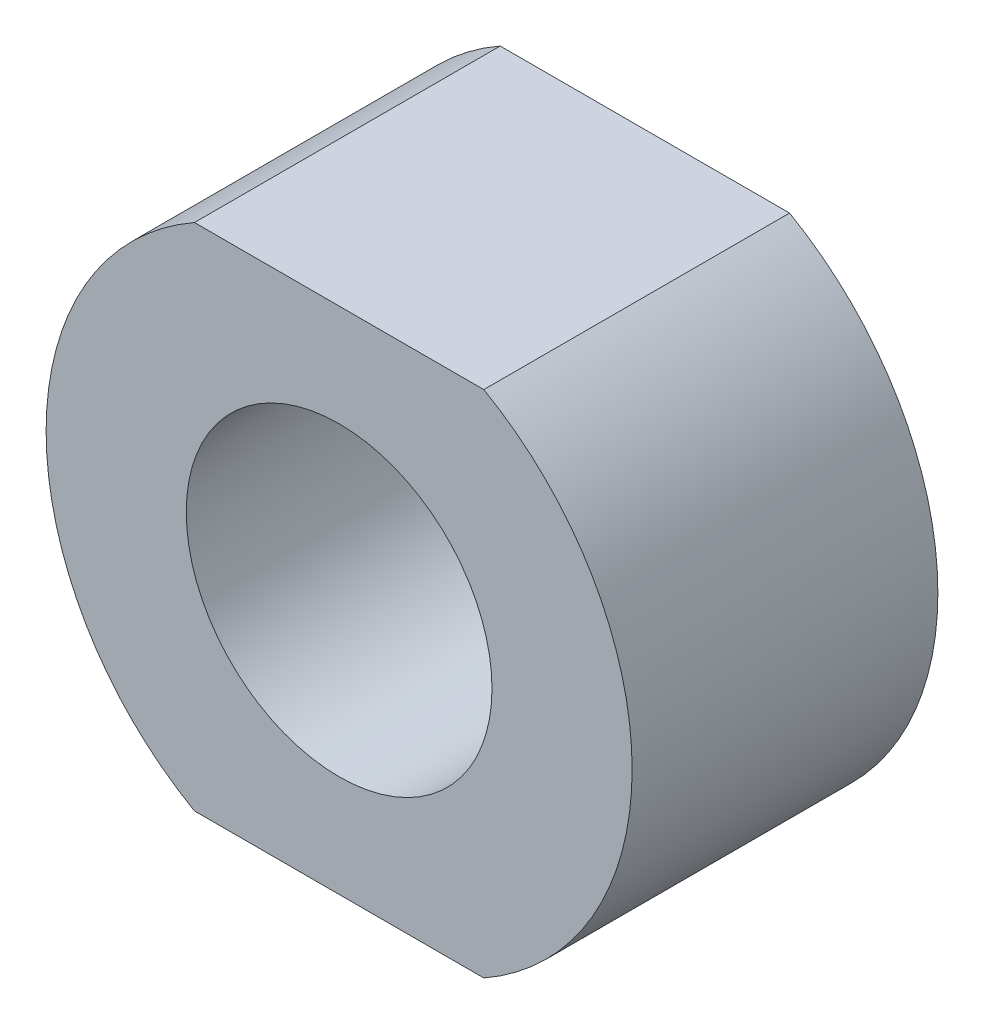
ISO-10303-21;
HEADER;
FILE_DESCRIPTION(('STEP AP214'),'2;1');
FILE_NAME('part.step','',(''),(''),'','','');
FILE_SCHEMA(('AUTOMOTIVE_DESIGN { 1 0 10303 214 1 1 1 1 }'));
ENDSEC;
DATA;
#1=APPLICATION_CONTEXT('core data for automotive mechanical design processes');
#2=APPLICATION_PROTOCOL_DEFINITION('international standard','automotive_design',2000,#1);
#3=PRODUCT_CONTEXT('',#1,'mechanical');
#4=PRODUCT('Part','Part','',(#3));
#5=PRODUCT_RELATED_PRODUCT_CATEGORY('part','',(#4));
#6=PRODUCT_DEFINITION_FORMATION('','',#4);
#7=PRODUCT_DEFINITION_CONTEXT('part definition',#1,'design');
#8=PRODUCT_DEFINITION('design','',#6,#7);
#9=PRODUCT_DEFINITION_SHAPE('','',#8);
#10=(LENGTH_UNIT() NAMED_UNIT(*) SI_UNIT(.MILLI.,.METRE.));
#11=(NAMED_UNIT(*) PLANE_ANGLE_UNIT() SI_UNIT($,.RADIAN.));
#12=(NAMED_UNIT(*) SI_UNIT($,.STERADIAN.) SOLID_ANGLE_UNIT());
#13=UNCERTAINTY_MEASURE_WITH_UNIT(LENGTH_MEASURE(1.E-05),#10,'distance_accuracy_value','');
#14=(GEOMETRIC_REPRESENTATION_CONTEXT(3) GLOBAL_UNCERTAINTY_ASSIGNED_CONTEXT((#13)) GLOBAL_UNIT_ASSIGNED_CONTEXT((#10,
#11,#12)) REPRESENTATION_CONTEXT('',''));
#15=CARTESIAN_POINT('',(0.,0.,0.));
#16=DIRECTION('',(0.,0.,1.));
#17=DIRECTION('',(1.,0.,0.));
#18=AXIS2_PLACEMENT_3D('',#15,#16,#17);
#19=CARTESIAN_POINT('',(0.,0.,6.));
#20=DIRECTION('',(0.,0.,-1.));
#21=DIRECTION('',(-1.,0.,0.));
#22=AXIS2_PLACEMENT_3D('',#19,#20,#21);
#23=CYLINDRICAL_SURFACE('',#22,5.75);
#24=CARTESIAN_POINT('',(0.,0.,6.));
#25=DIRECTION('',(0.,0.,1.));
#26=DIRECTION('',(1.,0.,0.));
#27=AXIS2_PLACEMENT_3D('',#24,#25,#26);
#28=CIRCLE('',#27,5.75);
#29=CARTESIAN_POINT('',(-2.83945417290014,5.,6.));
#30=VERTEX_POINT('',#29);
#31=CARTESIAN_POINT('',(-2.83945417290014,-5.,6.));
#32=VERTEX_POINT('',#31);
#33=EDGE_CURVE('E88',#30,#32,#28,.T.);
#34=ORIENTED_EDGE('',*,*,#33,.F.);
#35=DIRECTION('',(0.,0.,-1.));
#36=VECTOR('',#35,1.);
#37=CARTESIAN_POINT('',(-2.83945417290014,5.,6.));
#38=LINE('',#37,#36);
#39=CARTESIAN_POINT('',(-2.83945417290014,5.,0.));
#40=VERTEX_POINT('',#39);
#41=EDGE_CURVE('E105',#30,#40,#38,.T.);
#42=ORIENTED_EDGE('',*,*,#41,.T.);
#43=CARTESIAN_POINT('',(0.,0.,0.));
#44=DIRECTION('',(0.,0.,1.));
#45=DIRECTION('',(1.,0.,0.));
#46=AXIS2_PLACEMENT_3D('',#43,#44,#45);
#47=CIRCLE('',#46,5.75);
#48=CARTESIAN_POINT('',(-2.83945417290014,-5.,0.));
#49=VERTEX_POINT('',#48);
#50=EDGE_CURVE('E91',#40,#49,#47,.T.);
#51=ORIENTED_EDGE('',*,*,#50,.T.);
#52=DIRECTION('',(0.,0.,-1.));
#53=VECTOR('',#52,1.);
#54=CARTESIAN_POINT('',(-2.83945417290014,-5.,6.));
#55=LINE('',#54,#53);
#56=EDGE_CURVE('E48',#49,#32,#55,.F.);
#57=ORIENTED_EDGE('',*,*,#56,.T.);
#58=EDGE_LOOP('',(#34,#42,#51,#57));
#59=FACE_BOUND('',#58,.T.);
#60=ADVANCED_FACE('F33',(#59),#23,.T.);
#61=CARTESIAN_POINT('',(2.83945417290014,-5.,0.));
#62=VERTEX_POINT('',#61);
#63=CARTESIAN_POINT('',(2.83945417290014,5.,0.));
#64=VERTEX_POINT('',#63);
#65=EDGE_CURVE('E94',#62,#64,#47,.T.);
#66=ORIENTED_EDGE('',*,*,#65,.T.);
#67=DIRECTION('',(0.,0.,-1.));
#68=VECTOR('',#67,1.);
#69=CARTESIAN_POINT('',(2.83945417290014,5.,6.));
#70=LINE('',#69,#68);
#71=CARTESIAN_POINT('',(2.83945417290014,5.,6.));
#72=VERTEX_POINT('',#71);
#73=EDGE_CURVE('E56',#64,#72,#70,.F.);
#74=ORIENTED_EDGE('',*,*,#73,.T.);
#75=CARTESIAN_POINT('',(2.83945417290014,-5.,6.));
#76=VERTEX_POINT('',#75);
#77=EDGE_CURVE('E86',#76,#72,#28,.T.);
#78=ORIENTED_EDGE('',*,*,#77,.F.);
#79=DIRECTION('',(0.,0.,-1.));
#80=VECTOR('',#79,1.);
#81=CARTESIAN_POINT('',(2.83945417290014,-5.,6.));
#82=LINE('',#81,#80);
#83=EDGE_CURVE('E71',#76,#62,#82,.T.);
#84=ORIENTED_EDGE('',*,*,#83,.T.);
#85=EDGE_LOOP('',(#66,#74,#78,#84));
#86=FACE_BOUND('',#85,.T.);
#87=ADVANCED_FACE('F35',(#86),#23,.T.);
#88=CARTESIAN_POINT('',(0.,0.,6.));
#89=DIRECTION('',(0.,0.,1.));
#90=DIRECTION('',(1.,0.,0.));
#91=AXIS2_PLACEMENT_3D('',#88,#89,#90);
#92=PLANE('',#91);
#93=DIRECTION('',(1.,0.,0.));
#94=VECTOR('',#93,1.);
#95=CARTESIAN_POINT('',(-3.82647676527955,5.,6.));
#96=LINE('',#95,#94);
#97=EDGE_CURVE('E89',#30,#72,#96,.T.);
#98=ORIENTED_EDGE('',*,*,#97,.F.);
#99=ORIENTED_EDGE('',*,*,#33,.T.);
#100=DIRECTION('',(-1.,0.,0.));
#101=VECTOR('',#100,1.);
#102=CARTESIAN_POINT('',(-3.82647676527955,-5.,6.));
#103=LINE('',#102,#101);
#104=EDGE_CURVE('E74',#76,#32,#103,.T.);
#105=ORIENTED_EDGE('',*,*,#104,.F.);
#106=ORIENTED_EDGE('',*,*,#77,.T.);
#107=EDGE_LOOP('',(#98,#99,#105,#106));
#108=FACE_BOUND('',#107,.T.);
#109=CARTESIAN_POINT('',(0.,0.,6.));
#110=DIRECTION('',(0.,0.,1.));
#111=DIRECTION('',(1.,0.,0.));
#112=AXIS2_PLACEMENT_3D('',#109,#110,#111);
#113=CIRCLE('',#112,3.);
#114=CARTESIAN_POINT('',(3.,0.,6.));
#115=VERTEX_POINT('',#114);
#116=EDGE_CURVE('E97',#115,#115,#113,.T.);
#117=ORIENTED_EDGE('',*,*,#116,.F.);
#118=EDGE_LOOP('',(#117));
#119=FACE_BOUND('',#118,.T.);
#120=ADVANCED_FACE('F84',(#108,#119),#92,.T.);
#121=CARTESIAN_POINT('',(0.,0.,0.));
#122=DIRECTION('',(0.,0.,1.));
#123=DIRECTION('',(1.,0.,0.));
#124=AXIS2_PLACEMENT_3D('',#121,#122,#123);
#125=PLANE('',#124);
#126=CARTESIAN_POINT('',(0.,0.,0.));
#127=DIRECTION('',(0.,0.,1.));
#128=DIRECTION('',(1.,0.,0.));
#129=AXIS2_PLACEMENT_3D('',#126,#127,#128);
#130=CIRCLE('',#129,3.);
#131=CARTESIAN_POINT('',(3.,0.,0.));
#132=VERTEX_POINT('',#131);
#133=EDGE_CURVE('E99',#132,#132,#130,.T.);
#134=ORIENTED_EDGE('',*,*,#133,.T.);
#135=EDGE_LOOP('',(#134));
#136=FACE_BOUND('',#135,.T.);
#137=ORIENTED_EDGE('',*,*,#50,.F.);
#138=DIRECTION('',(1.,0.,0.));
#139=VECTOR('',#138,1.);
#140=CARTESIAN_POINT('',(0.,5.,0.));
#141=LINE('',#140,#139);
#142=EDGE_CURVE('E11',#40,#64,#141,.T.);
#143=ORIENTED_EDGE('',*,*,#142,.T.);
#144=ORIENTED_EDGE('',*,*,#65,.F.);
#145=DIRECTION('',(-1.,0.,0.));
#146=VECTOR('',#145,1.);
#147=CARTESIAN_POINT('',(0.,-5.,0.));
#148=LINE('',#147,#146);
#149=EDGE_CURVE('E41',#62,#49,#148,.T.);
#150=ORIENTED_EDGE('',*,*,#149,.T.);
#151=EDGE_LOOP('',(#137,#143,#144,#150));
#152=FACE_BOUND('',#151,.T.);
#153=ADVANCED_FACE('F102',(#136,#152),#125,.F.);
#154=CARTESIAN_POINT('',(0.,0.,0.));
#155=DIRECTION('',(0.,0.,1.));
#156=DIRECTION('',(1.,0.,0.));
#157=AXIS2_PLACEMENT_3D('',#154,#155,#156);
#158=CYLINDRICAL_SURFACE('',#157,3.);
#159=ORIENTED_EDGE('',*,*,#133,.F.);
#160=EDGE_LOOP('',(#159));
#161=FACE_BOUND('',#160,.T.);
#162=ORIENTED_EDGE('',*,*,#116,.T.);
#163=EDGE_LOOP('',(#162));
#164=FACE_BOUND('',#163,.T.);
#165=ADVANCED_FACE('F113',(#161,#164),#158,.F.);
#166=CARTESIAN_POINT('',(-3.82647676527955,-5.,0.));
#167=DIRECTION('',(0.,1.,0.));
#168=DIRECTION('',(0.,0.,1.));
#169=AXIS2_PLACEMENT_3D('',#166,#167,#168);
#170=PLANE('',#169);
#171=ORIENTED_EDGE('',*,*,#104,.T.);
#172=ORIENTED_EDGE('',*,*,#56,.F.);
#173=ORIENTED_EDGE('',*,*,#149,.F.);
#174=ORIENTED_EDGE('',*,*,#83,.F.);
#175=EDGE_LOOP('',(#171,#172,#173,#174));
#176=FACE_BOUND('',#175,.T.);
#177=ADVANCED_FACE('F73',(#176),#170,.F.);
#178=CARTESIAN_POINT('',(-3.82647676527955,5.,0.));
#179=DIRECTION('',(0.,-1.,0.));
#180=DIRECTION('',(0.,0.,-1.));
#181=AXIS2_PLACEMENT_3D('',#178,#179,#180);
#182=PLANE('',#181);
#183=ORIENTED_EDGE('',*,*,#97,.T.);
#184=ORIENTED_EDGE('',*,*,#73,.F.);
#185=ORIENTED_EDGE('',*,*,#142,.F.);
#186=ORIENTED_EDGE('',*,*,#41,.F.);
#187=EDGE_LOOP('',(#183,#184,#185,#186));
#188=FACE_BOUND('',#187,.T.);
#189=ADVANCED_FACE('F152',(#188),#182,.F.);
#190=CLOSED_SHELL('',(#60,#87,#120,#153,#165,#177,#189));
#191=MANIFOLD_SOLID_BREP('B2',#190);
#192=ADVANCED_BREP_SHAPE_REPRESENTATION('',(#18,#191),#14);
#193=SHAPE_DEFINITION_REPRESENTATION(#9,#192);
ENDSEC;
END-ISO-10303-21;
